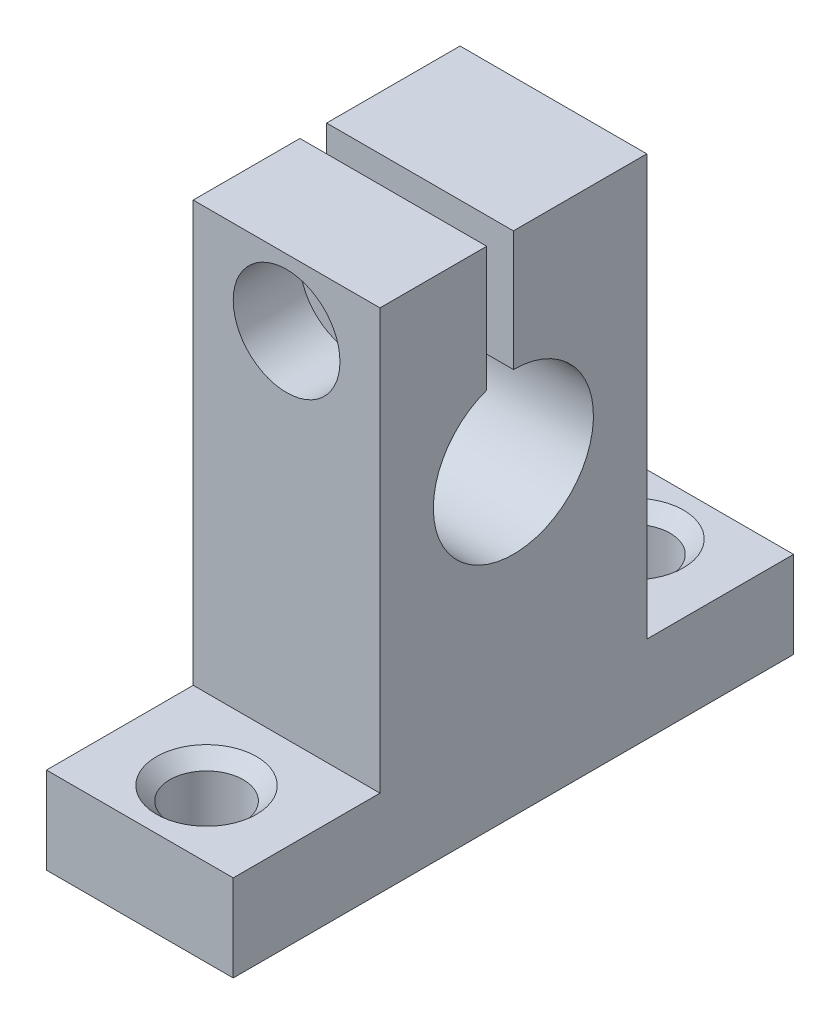
ISO-10303-21;
HEADER;
FILE_DESCRIPTION(('STEP AP214'),'2;1');
FILE_NAME('part.step','',(''),(''),'','','');
FILE_SCHEMA(('AUTOMOTIVE_DESIGN { 1 0 10303 214 1 1 1 1 }'));
ENDSEC;
DATA;
#1=APPLICATION_CONTEXT('core data for automotive mechanical design processes');
#2=APPLICATION_PROTOCOL_DEFINITION('international standard','automotive_design',2000,#1);
#3=PRODUCT_CONTEXT('',#1,'mechanical');
#4=PRODUCT('Part','Part','',(#3));
#5=PRODUCT_RELATED_PRODUCT_CATEGORY('part','',(#4));
#6=PRODUCT_DEFINITION_FORMATION('','',#4);
#7=PRODUCT_DEFINITION_CONTEXT('part definition',#1,'design');
#8=PRODUCT_DEFINITION('design','',#6,#7);
#9=PRODUCT_DEFINITION_SHAPE('','',#8);
#10=(LENGTH_UNIT() NAMED_UNIT(*) SI_UNIT(.MILLI.,.METRE.));
#11=(NAMED_UNIT(*) PLANE_ANGLE_UNIT() SI_UNIT($,.RADIAN.));
#12=(NAMED_UNIT(*) SI_UNIT($,.STERADIAN.) SOLID_ANGLE_UNIT());
#13=UNCERTAINTY_MEASURE_WITH_UNIT(LENGTH_MEASURE(1.E-05),#10,'distance_accuracy_value','');
#14=(GEOMETRIC_REPRESENTATION_CONTEXT(3) GLOBAL_UNCERTAINTY_ASSIGNED_CONTEXT((#13)) GLOBAL_UNIT_ASSIGNED_CONTEXT((#10,
#11,#12)) REPRESENTATION_CONTEXT('',''));
#15=CARTESIAN_POINT('',(0.,0.,0.));
#16=DIRECTION('',(0.,0.,1.));
#17=DIRECTION('',(1.,0.,0.));
#18=AXIS2_PLACEMENT_3D('',#15,#16,#17);
#19=CARTESIAN_POINT('',(0.,0.,-42.));
#20=DIRECTION('',(0.,0.,-1.));
#21=DIRECTION('',(0.,-1.,0.));
#22=AXIS2_PLACEMENT_3D('',#19,#20,#21);
#23=PLANE('',#22);
#24=DIRECTION('',(0.,1.,0.));
#25=VECTOR('',#24,1.);
#26=CARTESIAN_POINT('',(0.,0.,-42.));
#27=LINE('',#26,#25);
#28=CARTESIAN_POINT('',(0.,0.,-42.));
#29=VERTEX_POINT('',#28);
#30=CARTESIAN_POINT('',(0.,6.5,-42.));
#31=VERTEX_POINT('',#30);
#32=EDGE_CURVE('E298',#29,#31,#27,.T.);
#33=ORIENTED_EDGE('',*,*,#32,.T.);
#34=DIRECTION('',(1.,0.,0.));
#35=VECTOR('',#34,1.);
#36=CARTESIAN_POINT('',(0.,6.5,-42.));
#37=LINE('',#36,#35);
#38=CARTESIAN_POINT('',(14.,6.5,-42.));
#39=VERTEX_POINT('',#38);
#40=EDGE_CURVE('E338',#31,#39,#37,.T.);
#41=ORIENTED_EDGE('',*,*,#40,.T.);
#42=DIRECTION('',(0.,1.,0.));
#43=VECTOR('',#42,1.);
#44=CARTESIAN_POINT('',(14.,0.,-42.));
#45=LINE('',#44,#43);
#46=CARTESIAN_POINT('',(14.,0.,-42.));
#47=VERTEX_POINT('',#46);
#48=EDGE_CURVE('E272',#47,#39,#45,.T.);
#49=ORIENTED_EDGE('',*,*,#48,.F.);
#50=DIRECTION('',(1.,0.,0.));
#51=VECTOR('',#50,1.);
#52=CARTESIAN_POINT('',(0.,0.,-42.));
#53=LINE('',#52,#51);
#54=EDGE_CURVE('E277',#29,#47,#53,.T.);
#55=ORIENTED_EDGE('',*,*,#54,.F.);
#56=EDGE_LOOP('',(#33,#41,#49,#55));
#57=FACE_BOUND('',#56,.T.);
#58=ADVANCED_FACE('F17',(#57),#23,.T.);
#59=CARTESIAN_POINT('',(0.,6.5,-31.));
#60=DIRECTION('',(0.,0.,-1.));
#61=DIRECTION('',(-1.,0.,0.));
#62=AXIS2_PLACEMENT_3D('',#59,#60,#61);
#63=PLANE('',#62);
#64=CARTESIAN_POINT('',(7.,33.,-31.));
#65=DIRECTION('',(0.,0.,1.));
#66=DIRECTION('',(1.,0.,0.));
#67=AXIS2_PLACEMENT_3D('',#64,#65,#66);
#68=CIRCLE('',#67,2.);
#69=CARTESIAN_POINT('',(5.,33.,-31.));
#70=VERTEX_POINT('',#69);
#71=EDGE_CURVE('E218',#70,#70,#68,.T.);
#72=ORIENTED_EDGE('',*,*,#71,.T.);
#73=EDGE_LOOP('',(#72));
#74=FACE_BOUND('',#73,.T.);
#75=DIRECTION('',(0.,1.,0.));
#76=VECTOR('',#75,1.);
#77=CARTESIAN_POINT('',(0.,6.5,-31.));
#78=LINE('',#77,#76);
#79=CARTESIAN_POINT('',(0.,6.5,-31.));
#80=VERTEX_POINT('',#79);
#81=CARTESIAN_POINT('',(0.,38.,-31.));
#82=VERTEX_POINT('',#81);
#83=EDGE_CURVE('E400',#80,#82,#78,.T.);
#84=ORIENTED_EDGE('',*,*,#83,.T.);
#85=DIRECTION('',(1.,0.,0.));
#86=VECTOR('',#85,1.);
#87=CARTESIAN_POINT('',(0.,38.,-31.));
#88=LINE('',#87,#86);
#89=CARTESIAN_POINT('',(14.,38.,-31.));
#90=VERTEX_POINT('',#89);
#91=EDGE_CURVE('E11',#82,#90,#88,.T.);
#92=ORIENTED_EDGE('',*,*,#91,.T.);
#93=DIRECTION('',(0.,1.,0.));
#94=VECTOR('',#93,1.);
#95=CARTESIAN_POINT('',(14.,6.5,-31.));
#96=LINE('',#95,#94);
#97=CARTESIAN_POINT('',(14.,6.5,-31.));
#98=VERTEX_POINT('',#97);
#99=EDGE_CURVE('E287',#98,#90,#96,.T.);
#100=ORIENTED_EDGE('',*,*,#99,.F.);
#101=DIRECTION('',(1.,0.,0.));
#102=VECTOR('',#101,1.);
#103=CARTESIAN_POINT('',(0.,6.5,-31.));
#104=LINE('',#103,#102);
#105=EDGE_CURVE('E239',#80,#98,#104,.T.);
#106=ORIENTED_EDGE('',*,*,#105,.F.);
#107=EDGE_LOOP('',(#84,#92,#100,#106));
#108=FACE_BOUND('',#107,.T.);
#109=ADVANCED_FACE('F437',(#74,#108),#63,.T.);
#110=CARTESIAN_POINT('',(0.,38.,-31.));
#111=DIRECTION('',(0.,1.,0.));
#112=DIRECTION('',(0.,0.,-1.));
#113=AXIS2_PLACEMENT_3D('',#110,#111,#112);
#114=PLANE('',#113);
#115=DIRECTION('',(1.,0.,0.));
#116=VECTOR('',#115,1.);
#117=CARTESIAN_POINT('',(7.,38.,-21.));
#118=LINE('',#117,#116);
#119=CARTESIAN_POINT('',(0.,38.,-21.));
#120=VERTEX_POINT('',#119);
#121=CARTESIAN_POINT('',(14.,38.,-21.));
#122=VERTEX_POINT('',#121);
#123=EDGE_CURVE('E342',#120,#122,#118,.T.);
#124=ORIENTED_EDGE('',*,*,#123,.T.);
#125=DIRECTION('',(0.,0.,1.));
#126=VECTOR('',#125,1.);
#127=CARTESIAN_POINT('',(14.,38.,-31.));
#128=LINE('',#127,#126);
#129=EDGE_CURVE('E283',#90,#122,#128,.T.);
#130=ORIENTED_EDGE('',*,*,#129,.F.);
#131=ORIENTED_EDGE('',*,*,#91,.F.);
#132=DIRECTION('',(0.,0.,1.));
#133=VECTOR('',#132,1.);
#134=CARTESIAN_POINT('',(0.,38.,-31.));
#135=LINE('',#134,#133);
#136=EDGE_CURVE('E358',#82,#120,#135,.T.);
#137=ORIENTED_EDGE('',*,*,#136,.T.);
#138=EDGE_LOOP('',(#124,#130,#131,#137));
#139=FACE_BOUND('',#138,.T.);
#140=ADVANCED_FACE('F467',(#139),#114,.T.);
#141=CARTESIAN_POINT('',(0.,38.,-11.));
#142=DIRECTION('',(0.,0.,1.));
#143=DIRECTION('',(0.,-1.,0.));
#144=AXIS2_PLACEMENT_3D('',#141,#142,#143);
#145=PLANE('',#144);
#146=CARTESIAN_POINT('',(7.,33.,-11.));
#147=DIRECTION('',(0.,0.,-1.));
#148=DIRECTION('',(1.,0.,0.));
#149=AXIS2_PLACEMENT_3D('',#146,#147,#148);
#150=CIRCLE('',#149,4.);
#151=CARTESIAN_POINT('',(11.,33.,-11.));
#152=VERTEX_POINT('',#151);
#153=CARTESIAN_POINT('',(3.,33.,-11.));
#154=VERTEX_POINT('',#153);
#155=EDGE_CURVE('E313',#152,#154,#150,.T.);
#156=ORIENTED_EDGE('',*,*,#155,.T.);
#157=CARTESIAN_POINT('',(7.,33.,-11.));
#158=DIRECTION('',(0.,0.,-1.));
#159=DIRECTION('',(1.,0.,0.));
#160=AXIS2_PLACEMENT_3D('',#157,#158,#159);
#161=CIRCLE('',#160,4.);
#162=EDGE_CURVE('E252',#154,#152,#161,.T.);
#163=ORIENTED_EDGE('',*,*,#162,.T.);
#164=EDGE_LOOP('',(#156,#163));
#165=FACE_BOUND('',#164,.T.);
#166=DIRECTION('',(0.,-1.,0.));
#167=VECTOR('',#166,1.);
#168=CARTESIAN_POINT('',(0.,38.,-11.));
#169=LINE('',#168,#167);
#170=CARTESIAN_POINT('',(0.,38.,-11.));
#171=VERTEX_POINT('',#170);
#172=CARTESIAN_POINT('',(0.,6.5,-11.));
#173=VERTEX_POINT('',#172);
#174=EDGE_CURVE('E124',#171,#173,#169,.T.);
#175=ORIENTED_EDGE('',*,*,#174,.T.);
#176=DIRECTION('',(1.,0.,0.));
#177=VECTOR('',#176,1.);
#178=CARTESIAN_POINT('',(0.,6.5,-11.));
#179=LINE('',#178,#177);
#180=CARTESIAN_POINT('',(14.,6.5,-11.));
#181=VERTEX_POINT('',#180);
#182=EDGE_CURVE('E288',#173,#181,#179,.T.);
#183=ORIENTED_EDGE('',*,*,#182,.T.);
#184=DIRECTION('',(0.,-1.,0.));
#185=VECTOR('',#184,1.);
#186=CARTESIAN_POINT('',(14.,38.,-11.));
#187=LINE('',#186,#185);
#188=CARTESIAN_POINT('',(14.,38.,-11.));
#189=VERTEX_POINT('',#188);
#190=EDGE_CURVE('E364',#189,#181,#187,.T.);
#191=ORIENTED_EDGE('',*,*,#190,.F.);
#192=DIRECTION('',(1.,0.,0.));
#193=VECTOR('',#192,1.);
#194=CARTESIAN_POINT('',(0.,38.,-11.));
#195=LINE('',#194,#193);
#196=EDGE_CURVE('E355',#171,#189,#195,.T.);
#197=ORIENTED_EDGE('',*,*,#196,.F.);
#198=EDGE_LOOP('',(#175,#183,#191,#197));
#199=FACE_BOUND('',#198,.T.);
#200=ADVANCED_FACE('F455',(#165,#199),#145,.T.);
#201=CARTESIAN_POINT('',(0.,6.5,0.));
#202=DIRECTION('',(0.,0.,1.));
#203=DIRECTION('',(0.,-1.,0.));
#204=AXIS2_PLACEMENT_3D('',#201,#202,#203);
#205=PLANE('',#204);
#206=DIRECTION('',(0.,-1.,0.));
#207=VECTOR('',#206,1.);
#208=CARTESIAN_POINT('',(0.,6.5,0.));
#209=LINE('',#208,#207);
#210=CARTESIAN_POINT('',(0.,6.5,0.));
#211=VERTEX_POINT('',#210);
#212=CARTESIAN_POINT('',(0.,0.,0.));
#213=VERTEX_POINT('',#212);
#214=EDGE_CURVE('E112',#211,#213,#209,.T.);
#215=ORIENTED_EDGE('',*,*,#214,.T.);
#216=DIRECTION('',(1.,0.,0.));
#217=VECTOR('',#216,1.);
#218=CARTESIAN_POINT('',(0.,0.,0.));
#219=LINE('',#218,#217);
#220=CARTESIAN_POINT('',(14.,0.,0.));
#221=VERTEX_POINT('',#220);
#222=EDGE_CURVE('E28',#213,#221,#219,.T.);
#223=ORIENTED_EDGE('',*,*,#222,.T.);
#224=DIRECTION('',(0.,-1.,0.));
#225=VECTOR('',#224,1.);
#226=CARTESIAN_POINT('',(14.,6.5,0.));
#227=LINE('',#226,#225);
#228=CARTESIAN_POINT('',(14.,6.5,0.));
#229=VERTEX_POINT('',#228);
#230=EDGE_CURVE('E273',#229,#221,#227,.T.);
#231=ORIENTED_EDGE('',*,*,#230,.F.);
#232=DIRECTION('',(1.,0.,0.));
#233=VECTOR('',#232,1.);
#234=CARTESIAN_POINT('',(0.,6.5,0.));
#235=LINE('',#234,#233);
#236=EDGE_CURVE('E312',#211,#229,#235,.T.);
#237=ORIENTED_EDGE('',*,*,#236,.F.);
#238=EDGE_LOOP('',(#215,#223,#231,#237));
#239=FACE_BOUND('',#238,.T.);
#240=ADVANCED_FACE('F444',(#239),#205,.T.);
#241=CARTESIAN_POINT('',(0.,0.,0.));
#242=DIRECTION('',(0.,-1.,0.));
#243=DIRECTION('',(0.,0.,-1.));
#244=AXIS2_PLACEMENT_3D('',#241,#242,#243);
#245=PLANE('',#244);
#246=CARTESIAN_POINT('',(7.,0.,-37.));
#247=DIRECTION('',(0.,1.,0.));
#248=DIRECTION('',(1.,0.,0.));
#249=AXIS2_PLACEMENT_3D('',#246,#247,#248);
#250=CIRCLE('',#249,2.75);
#251=CARTESIAN_POINT('',(4.25,0.,-37.));
#252=VERTEX_POINT('',#251);
#253=EDGE_CURVE('E257',#252,#252,#250,.T.);
#254=ORIENTED_EDGE('',*,*,#253,.T.);
#255=EDGE_LOOP('',(#254));
#256=FACE_BOUND('',#255,.T.);
#257=CARTESIAN_POINT('',(7.,0.,-5.));
#258=DIRECTION('',(0.,1.,0.));
#259=DIRECTION('',(1.,0.,0.));
#260=AXIS2_PLACEMENT_3D('',#257,#258,#259);
#261=CIRCLE('',#260,2.75);
#262=CARTESIAN_POINT('',(4.25,0.,-5.));
#263=VERTEX_POINT('',#262);
#264=EDGE_CURVE('E304',#263,#263,#261,.T.);
#265=ORIENTED_EDGE('',*,*,#264,.T.);
#266=EDGE_LOOP('',(#265));
#267=FACE_BOUND('',#266,.T.);
#268=DIRECTION('',(0.,0.,-1.));
#269=VECTOR('',#268,1.);
#270=CARTESIAN_POINT('',(0.,0.,0.));
#271=LINE('',#270,#269);
#272=EDGE_CURVE('E238',#213,#29,#271,.T.);
#273=ORIENTED_EDGE('',*,*,#272,.T.);
#274=ORIENTED_EDGE('',*,*,#54,.T.);
#275=DIRECTION('',(0.,0.,-1.));
#276=VECTOR('',#275,1.);
#277=CARTESIAN_POINT('',(14.,0.,0.));
#278=LINE('',#277,#276);
#279=EDGE_CURVE('E268',#221,#47,#278,.T.);
#280=ORIENTED_EDGE('',*,*,#279,.F.);
#281=ORIENTED_EDGE('',*,*,#222,.F.);
#282=EDGE_LOOP('',(#273,#274,#280,#281));
#283=FACE_BOUND('',#282,.T.);
#284=ADVANCED_FACE('F441',(#256,#267,#283),#245,.T.);
#285=CARTESIAN_POINT('',(0.,23.,-21.));
#286=DIRECTION('',(1.,0.,0.));
#287=DIRECTION('',(0.,-1.,0.));
#288=AXIS2_PLACEMENT_3D('',#285,#286,#287);
#289=CYLINDRICAL_SURFACE('',#288,6.);
#290=DIRECTION('',(-1.,0.,0.));
#291=VECTOR('',#290,1.);
#292=CARTESIAN_POINT('',(0.,29.,-21.));
#293=LINE('',#292,#291);
#294=CARTESIAN_POINT('',(14.,29.,-21.));
#295=VERTEX_POINT('',#294);
#296=CARTESIAN_POINT('',(0.,29.,-21.));
#297=VERTEX_POINT('',#296);
#298=EDGE_CURVE('E374',#295,#297,#293,.T.);
#299=ORIENTED_EDGE('',*,*,#298,.T.);
#300=CARTESIAN_POINT('',(0.,23.,-21.));
#301=DIRECTION('',(-1.,0.,0.));
#302=DIRECTION('',(0.,-1.,0.));
#303=AXIS2_PLACEMENT_3D('',#300,#301,#302);
#304=CIRCLE('',#303,6.);
#305=CARTESIAN_POINT('',(0.,28.6568542494924,-19.));
#306=VERTEX_POINT('',#305);
#307=EDGE_CURVE('E274',#297,#306,#304,.T.);
#308=ORIENTED_EDGE('',*,*,#307,.T.);
#309=DIRECTION('',(1.,0.,0.));
#310=VECTOR('',#309,1.);
#311=CARTESIAN_POINT('',(0.,28.6568542494924,-19.));
#312=LINE('',#311,#310);
#313=CARTESIAN_POINT('',(14.,28.6568542494924,-19.));
#314=VERTEX_POINT('',#313);
#315=EDGE_CURVE('E266',#306,#314,#312,.T.);
#316=ORIENTED_EDGE('',*,*,#315,.T.);
#317=CARTESIAN_POINT('',(14.,23.,-21.));
#318=DIRECTION('',(-1.,0.,0.));
#319=DIRECTION('',(0.,-1.,0.));
#320=AXIS2_PLACEMENT_3D('',#317,#318,#319);
#321=CIRCLE('',#320,6.);
#322=EDGE_CURVE('E346',#295,#314,#321,.T.);
#323=ORIENTED_EDGE('',*,*,#322,.F.);
#324=EDGE_LOOP('',(#299,#308,#316,#323));
#325=FACE_BOUND('',#324,.T.);
#326=ADVANCED_FACE('F443',(#325),#289,.F.);
#327=CARTESIAN_POINT('',(0.,19.,-21.));
#328=DIRECTION('',(1.,0.,0.));
#329=DIRECTION('',(0.,1.,0.));
#330=AXIS2_PLACEMENT_3D('',#327,#328,#329);
#331=PLANE('',#330);
#332=DIRECTION('',(0.,1.,0.));
#333=VECTOR('',#332,1.);
#334=CARTESIAN_POINT('',(0.,28.5,-21.));
#335=LINE('',#334,#333);
#336=EDGE_CURVE('E296',#297,#120,#335,.T.);
#337=ORIENTED_EDGE('',*,*,#336,.T.);
#338=ORIENTED_EDGE('',*,*,#136,.F.);
#339=ORIENTED_EDGE('',*,*,#83,.F.);
#340=DIRECTION('',(0.,0.,1.));
#341=VECTOR('',#340,1.);
#342=CARTESIAN_POINT('',(0.,6.5,-42.));
#343=LINE('',#342,#341);
#344=EDGE_CURVE('E244',#31,#80,#343,.T.);
#345=ORIENTED_EDGE('',*,*,#344,.F.);
#346=ORIENTED_EDGE('',*,*,#32,.F.);
#347=ORIENTED_EDGE('',*,*,#272,.F.);
#348=ORIENTED_EDGE('',*,*,#214,.F.);
#349=DIRECTION('',(0.,0.,1.));
#350=VECTOR('',#349,1.);
#351=CARTESIAN_POINT('',(0.,6.5,-11.));
#352=LINE('',#351,#350);
#353=EDGE_CURVE('E350',#173,#211,#352,.T.);
#354=ORIENTED_EDGE('',*,*,#353,.F.);
#355=ORIENTED_EDGE('',*,*,#174,.F.);
#356=DIRECTION('',(0.,0.,1.));
#357=VECTOR('',#356,1.);
#358=CARTESIAN_POINT('',(0.,38.,-31.));
#359=LINE('',#358,#357);
#360=CARTESIAN_POINT('',(0.,38.,-19.));
#361=VERTEX_POINT('',#360);
#362=EDGE_CURVE('E286',#361,#171,#359,.T.);
#363=ORIENTED_EDGE('',*,*,#362,.F.);
#364=DIRECTION('',(0.,-1.,0.));
#365=VECTOR('',#364,1.);
#366=CARTESIAN_POINT('',(0.,19.816578345221,-19.));
#367=LINE('',#366,#365);
#368=EDGE_CURVE('E261',#361,#306,#367,.T.);
#369=ORIENTED_EDGE('',*,*,#368,.T.);
#370=ORIENTED_EDGE('',*,*,#307,.F.);
#371=EDGE_LOOP('',(#337,#338,#339,#345,#346,#347,#348,#354,#355,#363,#369,#370));
#372=FACE_BOUND('',#371,.T.);
#373=ADVANCED_FACE('F433',(#372),#331,.F.);
#374=CARTESIAN_POINT('',(0.,38.,-31.));
#375=DIRECTION('',(0.,1.,0.));
#376=DIRECTION('',(0.,0.,-1.));
#377=AXIS2_PLACEMENT_3D('',#374,#375,#376);
#378=PLANE('',#377);
#379=DIRECTION('',(-1.,0.,0.));
#380=VECTOR('',#379,1.);
#381=CARTESIAN_POINT('',(7.,38.,-19.));
#382=LINE('',#381,#380);
#383=CARTESIAN_POINT('',(14.,38.,-19.));
#384=VERTEX_POINT('',#383);
#385=EDGE_CURVE('E267',#384,#361,#382,.T.);
#386=ORIENTED_EDGE('',*,*,#385,.T.);
#387=ORIENTED_EDGE('',*,*,#362,.T.);
#388=ORIENTED_EDGE('',*,*,#196,.T.);
#389=DIRECTION('',(0.,0.,1.));
#390=VECTOR('',#389,1.);
#391=CARTESIAN_POINT('',(14.,38.,-31.));
#392=LINE('',#391,#390);
#393=EDGE_CURVE('E370',#384,#189,#392,.T.);
#394=ORIENTED_EDGE('',*,*,#393,.F.);
#395=EDGE_LOOP('',(#386,#387,#388,#394));
#396=FACE_BOUND('',#395,.T.);
#397=ADVANCED_FACE('F691',(#396),#378,.T.);
#398=CARTESIAN_POINT('',(14.,19.,-21.));
#399=DIRECTION('',(1.,0.,0.));
#400=DIRECTION('',(0.,1.,0.));
#401=AXIS2_PLACEMENT_3D('',#398,#399,#400);
#402=PLANE('',#401);
#403=DIRECTION('',(0.,-1.,0.));
#404=VECTOR('',#403,1.);
#405=CARTESIAN_POINT('',(14.,28.5,-21.));
#406=LINE('',#405,#404);
#407=EDGE_CURVE('E347',#122,#295,#406,.T.);
#408=ORIENTED_EDGE('',*,*,#407,.T.);
#409=ORIENTED_EDGE('',*,*,#322,.T.);
#410=DIRECTION('',(0.,1.,0.));
#411=VECTOR('',#410,1.);
#412=CARTESIAN_POINT('',(14.,19.816578345221,-19.));
#413=LINE('',#412,#411);
#414=EDGE_CURVE('E262',#314,#384,#413,.T.);
#415=ORIENTED_EDGE('',*,*,#414,.T.);
#416=ORIENTED_EDGE('',*,*,#393,.T.);
#417=ORIENTED_EDGE('',*,*,#190,.T.);
#418=DIRECTION('',(0.,0.,1.));
#419=VECTOR('',#418,1.);
#420=CARTESIAN_POINT('',(14.,6.5,-11.));
#421=LINE('',#420,#419);
#422=EDGE_CURVE('E292',#181,#229,#421,.T.);
#423=ORIENTED_EDGE('',*,*,#422,.T.);
#424=ORIENTED_EDGE('',*,*,#230,.T.);
#425=ORIENTED_EDGE('',*,*,#279,.T.);
#426=ORIENTED_EDGE('',*,*,#48,.T.);
#427=DIRECTION('',(0.,0.,1.));
#428=VECTOR('',#427,1.);
#429=CARTESIAN_POINT('',(14.,6.5,-42.));
#430=LINE('',#429,#428);
#431=EDGE_CURVE('E243',#39,#98,#430,.T.);
#432=ORIENTED_EDGE('',*,*,#431,.T.);
#433=ORIENTED_EDGE('',*,*,#99,.T.);
#434=ORIENTED_EDGE('',*,*,#129,.T.);
#435=EDGE_LOOP('',(#408,#409,#415,#416,#417,#423,#424,#425,#426,#432,#433,#434));
#436=FACE_BOUND('',#435,.T.);
#437=ADVANCED_FACE('F440',(#436),#402,.T.);
#438=CARTESIAN_POINT('',(14.,38.,-21.));
#439=DIRECTION('',(0.,0.,-1.));
#440=DIRECTION('',(0.,-1.,0.));
#441=AXIS2_PLACEMENT_3D('',#438,#439,#440);
#442=PLANE('',#441);
#443=CARTESIAN_POINT('',(7.,33.,-21.));
#444=DIRECTION('',(0.,0.,-1.));
#445=DIRECTION('',(1.,0.,0.));
#446=AXIS2_PLACEMENT_3D('',#443,#444,#445);
#447=CIRCLE('',#446,2.);
#448=CARTESIAN_POINT('',(5.,33.,-21.));
#449=VERTEX_POINT('',#448);
#450=EDGE_CURVE('E291',#449,#449,#447,.T.);
#451=ORIENTED_EDGE('',*,*,#450,.T.);
#452=EDGE_LOOP('',(#451));
#453=FACE_BOUND('',#452,.T.);
#454=ORIENTED_EDGE('',*,*,#336,.F.);
#455=ORIENTED_EDGE('',*,*,#298,.F.);
#456=ORIENTED_EDGE('',*,*,#407,.F.);
#457=ORIENTED_EDGE('',*,*,#123,.F.);
#458=EDGE_LOOP('',(#454,#455,#456,#457));
#459=FACE_BOUND('',#458,.T.);
#460=ADVANCED_FACE('F480',(#453,#459),#442,.F.);
#461=CARTESIAN_POINT('',(14.,20.633156690442,-19.));
#462=DIRECTION('',(0.,0.,1.));
#463=DIRECTION('',(0.,-1.,0.));
#464=AXIS2_PLACEMENT_3D('',#461,#462,#463);
#465=PLANE('',#464);
#466=CARTESIAN_POINT('',(7.,33.,-19.));
#467=DIRECTION('',(0.,0.,1.));
#468=DIRECTION('',(1.,0.,0.));
#469=AXIS2_PLACEMENT_3D('',#466,#467,#468);
#470=CIRCLE('',#469,2.);
#471=CARTESIAN_POINT('',(5.,33.,-19.));
#472=VERTEX_POINT('',#471);
#473=EDGE_CURVE('E216',#472,#472,#470,.T.);
#474=ORIENTED_EDGE('',*,*,#473,.T.);
#475=EDGE_LOOP('',(#474));
#476=FACE_BOUND('',#475,.T.);
#477=ORIENTED_EDGE('',*,*,#368,.F.);
#478=ORIENTED_EDGE('',*,*,#385,.F.);
#479=ORIENTED_EDGE('',*,*,#414,.F.);
#480=ORIENTED_EDGE('',*,*,#315,.F.);
#481=EDGE_LOOP('',(#477,#478,#479,#480));
#482=FACE_BOUND('',#481,.T.);
#483=ADVANCED_FACE('F478',(#476,#482),#465,.F.);
#484=CARTESIAN_POINT('',(7.,33.,-11.));
#485=DIRECTION('',(0.,0.,-1.));
#486=DIRECTION('',(1.,0.,0.));
#487=AXIS2_PLACEMENT_3D('',#484,#485,#486);
#488=CYLINDRICAL_SURFACE('',#487,2.);
#489=CARTESIAN_POINT('',(7.,33.,-16.));
#490=DIRECTION('',(0.,0.,1.));
#491=DIRECTION('',(1.,0.,0.));
#492=AXIS2_PLACEMENT_3D('',#489,#490,#491);
#493=CIRCLE('',#492,2.);
#494=CARTESIAN_POINT('',(9.,33.,-16.));
#495=VERTEX_POINT('',#494);
#496=CARTESIAN_POINT('',(5.,33.,-16.));
#497=VERTEX_POINT('',#496);
#498=EDGE_CURVE('E223',#495,#497,#493,.T.);
#499=ORIENTED_EDGE('',*,*,#498,.T.);
#500=DIRECTION('',(0.,0.,-1.));
#501=VECTOR('',#500,1.);
#502=CARTESIAN_POINT('',(5.,33.,-11.));
#503=LINE('',#502,#501);
#504=EDGE_CURVE('E210',#497,#472,#503,.T.);
#505=ORIENTED_EDGE('',*,*,#504,.T.);
#506=ORIENTED_EDGE('',*,*,#473,.F.);
#507=ORIENTED_EDGE('',*,*,#504,.F.);
#508=CARTESIAN_POINT('',(7.,33.,-16.));
#509=DIRECTION('',(0.,0.,1.));
#510=DIRECTION('',(1.,0.,0.));
#511=AXIS2_PLACEMENT_3D('',#508,#509,#510);
#512=CIRCLE('',#511,2.);
#513=EDGE_CURVE('E214',#497,#495,#512,.T.);
#514=ORIENTED_EDGE('',*,*,#513,.T.);
#515=EDGE_LOOP('',(#499,#505,#506,#507,#514));
#516=FACE_BOUND('',#515,.T.);
#517=ADVANCED_FACE('F213',(#516),#488,.F.);
#518=CARTESIAN_POINT('',(7.,33.,-11.));
#519=DIRECTION('',(0.,0.,-1.));
#520=DIRECTION('',(1.,0.,0.));
#521=AXIS2_PLACEMENT_3D('',#518,#519,#520);
#522=CYLINDRICAL_SURFACE('',#521,2.);
#523=ORIENTED_EDGE('',*,*,#450,.F.);
#524=DIRECTION('',(0.,0.,-1.));
#525=VECTOR('',#524,1.);
#526=CARTESIAN_POINT('',(5.,33.,-11.));
#527=LINE('',#526,#525);
#528=EDGE_CURVE('E247',#449,#70,#527,.T.);
#529=ORIENTED_EDGE('',*,*,#528,.T.);
#530=ORIENTED_EDGE('',*,*,#71,.F.);
#531=ORIENTED_EDGE('',*,*,#528,.F.);
#532=EDGE_LOOP('',(#523,#529,#530,#531));
#533=FACE_BOUND('',#532,.T.);
#534=ADVANCED_FACE('F19',(#533),#522,.F.);
#535=CARTESIAN_POINT('',(0.,6.5,-11.));
#536=DIRECTION('',(0.,1.,0.));
#537=DIRECTION('',(0.,0.,-1.));
#538=AXIS2_PLACEMENT_3D('',#535,#536,#537);
#539=PLANE('',#538);
#540=CARTESIAN_POINT('',(7.,6.5,-5.));
#541=DIRECTION('',(0.,1.,0.));
#542=DIRECTION('',(-1.,0.,0.));
#543=AXIS2_PLACEMENT_3D('',#540,#541,#542);
#544=CIRCLE('',#543,3.75);
#545=CARTESIAN_POINT('',(10.75,6.5,-5.));
#546=VERTEX_POINT('',#545);
#547=EDGE_CURVE('E354',#546,#546,#544,.T.);
#548=ORIENTED_EDGE('',*,*,#547,.F.);
#549=EDGE_LOOP('',(#548));
#550=FACE_BOUND('',#549,.T.);
#551=ORIENTED_EDGE('',*,*,#353,.T.);
#552=ORIENTED_EDGE('',*,*,#236,.T.);
#553=ORIENTED_EDGE('',*,*,#422,.F.);
#554=ORIENTED_EDGE('',*,*,#182,.F.);
#555=EDGE_LOOP('',(#551,#552,#553,#554));
#556=FACE_BOUND('',#555,.T.);
#557=ADVANCED_FACE('F473',(#550,#556),#539,.T.);
#558=CARTESIAN_POINT('',(7.,6.5,-5.));
#559=DIRECTION('',(0.,-1.,0.));
#560=DIRECTION('',(1.,0.,0.));
#561=AXIS2_PLACEMENT_3D('',#558,#559,#560);
#562=CYLINDRICAL_SURFACE('',#561,2.75);
#563=CARTESIAN_POINT('',(7.,5.5,-5.));
#564=DIRECTION('',(0.,-1.,0.));
#565=DIRECTION('',(-1.,0.,0.));
#566=AXIS2_PLACEMENT_3D('',#563,#564,#565);
#567=CIRCLE('',#566,2.75);
#568=CARTESIAN_POINT('',(9.75,5.5,-5.));
#569=VERTEX_POINT('',#568);
#570=CARTESIAN_POINT('',(4.25,5.5,-5.));
#571=VERTEX_POINT('',#570);
#572=EDGE_CURVE('E327',#569,#571,#567,.T.);
#573=ORIENTED_EDGE('',*,*,#572,.F.);
#574=CARTESIAN_POINT('',(7.,5.5,-5.));
#575=DIRECTION('',(0.,-1.,0.));
#576=DIRECTION('',(-1.,0.,0.));
#577=AXIS2_PLACEMENT_3D('',#574,#575,#576);
#578=CIRCLE('',#577,2.75);
#579=EDGE_CURVE('E305',#571,#569,#578,.T.);
#580=ORIENTED_EDGE('',*,*,#579,.F.);
#581=DIRECTION('',(0.,-1.,0.));
#582=VECTOR('',#581,1.);
#583=CARTESIAN_POINT('',(4.25,6.5,-5.));
#584=LINE('',#583,#582);
#585=EDGE_CURVE('E300',#571,#263,#584,.T.);
#586=ORIENTED_EDGE('',*,*,#585,.T.);
#587=ORIENTED_EDGE('',*,*,#264,.F.);
#588=ORIENTED_EDGE('',*,*,#585,.F.);
#589=EDGE_LOOP('',(#573,#580,#586,#587,#588));
#590=FACE_BOUND('',#589,.T.);
#591=ADVANCED_FACE('F476',(#590),#562,.F.);
#592=CARTESIAN_POINT('',(7.,6.,-5.));
#593=DIRECTION('',(0.,1.,0.));
#594=DIRECTION('',(-1.,0.,0.));
#595=AXIS2_PLACEMENT_3D('',#592,#593,#594);
#596=CONICAL_SURFACE('',#595,3.25,0.785398163397449);
#597=ORIENTED_EDGE('',*,*,#547,.T.);
#598=DIRECTION('',(-0.707106781186548,-0.707106781186547,0.));
#599=VECTOR('',#598,1.);
#600=CARTESIAN_POINT('',(10.25,6.,-5.));
#601=LINE('',#600,#599);
#602=EDGE_CURVE('E331',#546,#569,#601,.T.);
#603=ORIENTED_EDGE('',*,*,#602,.T.);
#604=ORIENTED_EDGE('',*,*,#572,.T.);
#605=ORIENTED_EDGE('',*,*,#579,.T.);
#606=ORIENTED_EDGE('',*,*,#602,.F.);
#607=EDGE_LOOP('',(#597,#603,#604,#605,#606));
#608=FACE_BOUND('',#607,.T.);
#609=ADVANCED_FACE('F493',(#608),#596,.F.);
#610=CARTESIAN_POINT('',(0.,6.5,-42.));
#611=DIRECTION('',(0.,1.,0.));
#612=DIRECTION('',(0.,0.,-1.));
#613=AXIS2_PLACEMENT_3D('',#610,#611,#612);
#614=PLANE('',#613);
#615=CARTESIAN_POINT('',(7.,6.5,-37.));
#616=DIRECTION('',(0.,1.,0.));
#617=DIRECTION('',(-1.,0.,0.));
#618=AXIS2_PLACEMENT_3D('',#615,#616,#617);
#619=CIRCLE('',#618,3.75);
#620=CARTESIAN_POINT('',(10.75,6.5,-37.));
#621=VERTEX_POINT('',#620);
#622=EDGE_CURVE('E21',#621,#621,#619,.T.);
#623=ORIENTED_EDGE('',*,*,#622,.F.);
#624=EDGE_LOOP('',(#623));
#625=FACE_BOUND('',#624,.T.);
#626=ORIENTED_EDGE('',*,*,#344,.T.);
#627=ORIENTED_EDGE('',*,*,#105,.T.);
#628=ORIENTED_EDGE('',*,*,#431,.F.);
#629=ORIENTED_EDGE('',*,*,#40,.F.);
#630=EDGE_LOOP('',(#626,#627,#628,#629));
#631=FACE_BOUND('',#630,.T.);
#632=ADVANCED_FACE('F432',(#625,#631),#614,.T.);
#633=CARTESIAN_POINT('',(7.,6.5,-37.));
#634=DIRECTION('',(0.,-1.,0.));
#635=DIRECTION('',(1.,0.,0.));
#636=AXIS2_PLACEMENT_3D('',#633,#634,#635);
#637=CYLINDRICAL_SURFACE('',#636,2.75);
#638=CARTESIAN_POINT('',(7.,5.5,-37.));
#639=DIRECTION('',(0.,-1.,0.));
#640=DIRECTION('',(-1.,0.,0.));
#641=AXIS2_PLACEMENT_3D('',#638,#639,#640);
#642=CIRCLE('',#641,2.75);
#643=CARTESIAN_POINT('',(9.75,5.5,-37.));
#644=VERTEX_POINT('',#643);
#645=CARTESIAN_POINT('',(4.25,5.5,-37.));
#646=VERTEX_POINT('',#645);
#647=EDGE_CURVE('E281',#644,#646,#642,.T.);
#648=ORIENTED_EDGE('',*,*,#647,.F.);
#649=CARTESIAN_POINT('',(7.,5.5,-37.));
#650=DIRECTION('',(0.,-1.,0.));
#651=DIRECTION('',(-1.,0.,0.));
#652=AXIS2_PLACEMENT_3D('',#649,#650,#651);
#653=CIRCLE('',#652,2.75);
#654=EDGE_CURVE('E258',#646,#644,#653,.T.);
#655=ORIENTED_EDGE('',*,*,#654,.F.);
#656=DIRECTION('',(0.,-1.,0.));
#657=VECTOR('',#656,1.);
#658=CARTESIAN_POINT('',(4.25,6.5,-37.));
#659=LINE('',#658,#657);
#660=EDGE_CURVE('E253',#646,#252,#659,.T.);
#661=ORIENTED_EDGE('',*,*,#660,.T.);
#662=ORIENTED_EDGE('',*,*,#253,.F.);
#663=ORIENTED_EDGE('',*,*,#660,.F.);
#664=EDGE_LOOP('',(#648,#655,#661,#662,#663));
#665=FACE_BOUND('',#664,.T.);
#666=ADVANCED_FACE('F482',(#665),#637,.F.);
#667=CARTESIAN_POINT('',(7.,6.,-37.));
#668=DIRECTION('',(0.,1.,0.));
#669=DIRECTION('',(-1.,0.,0.));
#670=AXIS2_PLACEMENT_3D('',#667,#668,#669);
#671=CONICAL_SURFACE('',#670,3.25,0.78539816339745);
#672=ORIENTED_EDGE('',*,*,#622,.T.);
#673=DIRECTION('',(-0.707106781186549,-0.707106781186547,0.));
#674=VECTOR('',#673,1.);
#675=CARTESIAN_POINT('',(10.25,6.,-37.));
#676=LINE('',#675,#674);
#677=EDGE_CURVE('E278',#621,#644,#676,.T.);
#678=ORIENTED_EDGE('',*,*,#677,.T.);
#679=ORIENTED_EDGE('',*,*,#647,.T.);
#680=ORIENTED_EDGE('',*,*,#654,.T.);
#681=ORIENTED_EDGE('',*,*,#677,.F.);
#682=EDGE_LOOP('',(#672,#678,#679,#680,#681));
#683=FACE_BOUND('',#682,.T.);
#684=ADVANCED_FACE('F484',(#683),#671,.F.);
#685=CARTESIAN_POINT('',(7.,33.,-16.));
#686=DIRECTION('',(0.,0.,1.));
#687=DIRECTION('',(0.,-1.,0.));
#688=AXIS2_PLACEMENT_3D('',#685,#686,#687);
#689=PLANE('',#688);
#690=ORIENTED_EDGE('',*,*,#498,.F.);
#691=ORIENTED_EDGE('',*,*,#513,.F.);
#692=EDGE_LOOP('',(#690,#691));
#693=FACE_BOUND('',#692,.T.);
#694=CARTESIAN_POINT('',(7.,33.,-16.));
#695=DIRECTION('',(0.,0.,-1.));
#696=DIRECTION('',(1.,0.,0.));
#697=AXIS2_PLACEMENT_3D('',#694,#695,#696);
#698=CIRCLE('',#697,4.);
#699=CARTESIAN_POINT('',(11.,33.,-16.));
#700=VERTEX_POINT('',#699);
#701=CARTESIAN_POINT('',(3.,33.,-16.));
#702=VERTEX_POINT('',#701);
#703=EDGE_CURVE('E227',#700,#702,#698,.T.);
#704=ORIENTED_EDGE('',*,*,#703,.F.);
#705=CARTESIAN_POINT('',(7.,33.,-16.));
#706=DIRECTION('',(0.,0.,-1.));
#707=DIRECTION('',(1.,0.,0.));
#708=AXIS2_PLACEMENT_3D('',#705,#706,#707);
#709=CIRCLE('',#708,4.);
#710=EDGE_CURVE('E233',#702,#700,#709,.T.);
#711=ORIENTED_EDGE('',*,*,#710,.F.);
#712=EDGE_LOOP('',(#704,#711));
#713=FACE_BOUND('',#712,.T.);
#714=ADVANCED_FACE('F221',(#693,#713),#689,.T.);
#715=CARTESIAN_POINT('',(7.,33.,-11.));
#716=DIRECTION('',(0.,0.,-1.));
#717=DIRECTION('',(1.,0.,0.));
#718=AXIS2_PLACEMENT_3D('',#715,#716,#717);
#719=CYLINDRICAL_SURFACE('',#718,4.);
#720=ORIENTED_EDGE('',*,*,#155,.F.);
#721=ORIENTED_EDGE('',*,*,#162,.F.);
#722=DIRECTION('',(0.,0.,-1.));
#723=VECTOR('',#722,1.);
#724=CARTESIAN_POINT('',(3.,33.,-11.));
#725=LINE('',#724,#723);
#726=EDGE_CURVE('E248',#154,#702,#725,.T.);
#727=ORIENTED_EDGE('',*,*,#726,.T.);
#728=ORIENTED_EDGE('',*,*,#710,.T.);
#729=ORIENTED_EDGE('',*,*,#703,.T.);
#730=ORIENTED_EDGE('',*,*,#726,.F.);
#731=EDGE_LOOP('',(#720,#721,#727,#728,#729,#730));
#732=FACE_BOUND('',#731,.T.);
#733=ADVANCED_FACE('F704',(#732),#719,.F.);
#734=CLOSED_SHELL('',(#58,#109,#140,#200,#240,#284,#326,#373,#397,#437,#460,#483,#517,#534,#557,
#591,#609,#632,#666,#684,#714,#733));
#735=MANIFOLD_SOLID_BREP('B1',#734);
#736=ADVANCED_BREP_SHAPE_REPRESENTATION('',(#18,#735),#14);
#737=SHAPE_DEFINITION_REPRESENTATION(#9,#736);
ENDSEC;
END-ISO-10303-21;
